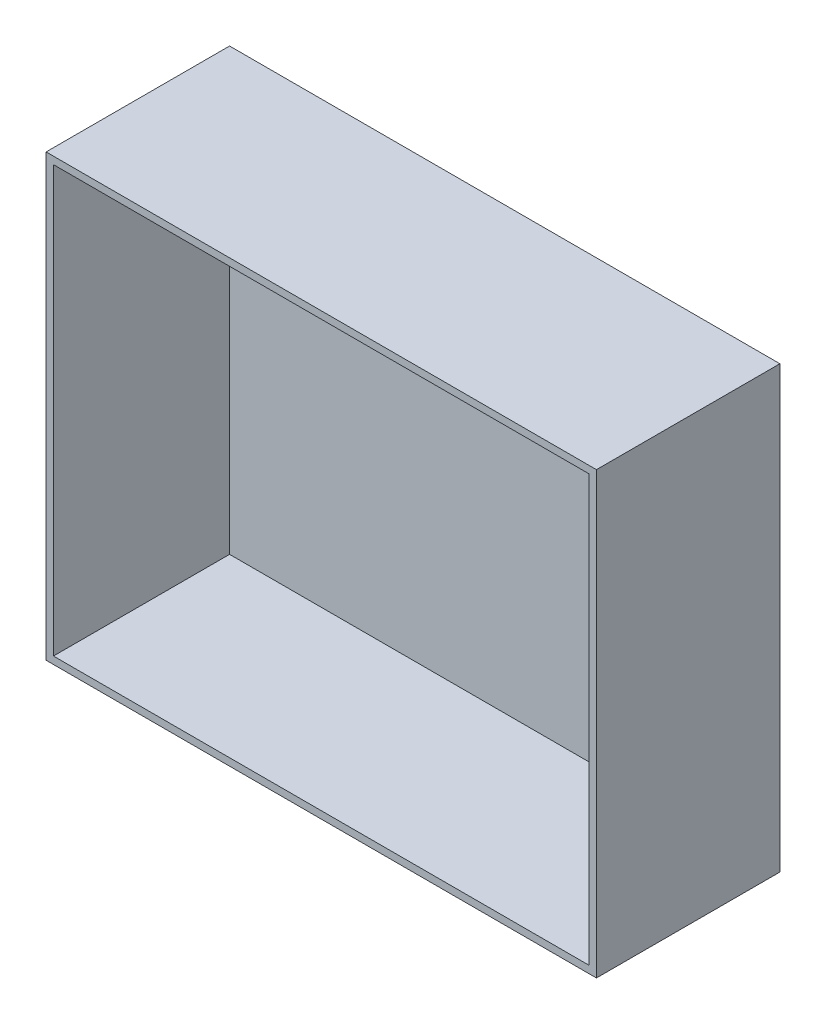
ISO-10303-21;
HEADER;
FILE_DESCRIPTION(('STEP AP214'),'2;1');
FILE_NAME('part.step','',(''),(''),'','','');
FILE_SCHEMA(('AUTOMOTIVE_DESIGN { 1 0 10303 214 1 1 1 1 }'));
ENDSEC;
DATA;
#1=APPLICATION_CONTEXT('core data for automotive mechanical design processes');
#2=APPLICATION_PROTOCOL_DEFINITION('international standard','automotive_design',2000,#1);
#3=PRODUCT_CONTEXT('',#1,'mechanical');
#4=PRODUCT('Part','Part','',(#3));
#5=PRODUCT_RELATED_PRODUCT_CATEGORY('part','',(#4));
#6=PRODUCT_DEFINITION_FORMATION('','',#4);
#7=PRODUCT_DEFINITION_CONTEXT('part definition',#1,'design');
#8=PRODUCT_DEFINITION('design','',#6,#7);
#9=PRODUCT_DEFINITION_SHAPE('','',#8);
#10=(LENGTH_UNIT() NAMED_UNIT(*) SI_UNIT(.MILLI.,.METRE.));
#11=(NAMED_UNIT(*) PLANE_ANGLE_UNIT() SI_UNIT($,.RADIAN.));
#12=(NAMED_UNIT(*) SI_UNIT($,.STERADIAN.) SOLID_ANGLE_UNIT());
#13=UNCERTAINTY_MEASURE_WITH_UNIT(LENGTH_MEASURE(1.E-05),#10,'distance_accuracy_value','');
#14=(GEOMETRIC_REPRESENTATION_CONTEXT(3) GLOBAL_UNCERTAINTY_ASSIGNED_CONTEXT((#13)) GLOBAL_UNIT_ASSIGNED_CONTEXT((#10,
#11,#12)) REPRESENTATION_CONTEXT('',''));
#15=CARTESIAN_POINT('',(0.,0.,0.));
#16=DIRECTION('',(0.,0.,1.));
#17=DIRECTION('',(1.,0.,0.));
#18=AXIS2_PLACEMENT_3D('',#15,#16,#17);
#19=CARTESIAN_POINT('',(75.,60.,25.));
#20=DIRECTION('',(-1.,0.,0.));
#21=DIRECTION('',(0.,-1.,0.));
#22=AXIS2_PLACEMENT_3D('',#19,#20,#21);
#23=PLANE('',#22);
#24=DIRECTION('',(0.,1.,0.));
#25=VECTOR('',#24,1.);
#26=CARTESIAN_POINT('',(75.,60.,-25.));
#27=LINE('',#26,#25);
#28=CARTESIAN_POINT('',(75.,-60.,-25.));
#29=VERTEX_POINT('',#28);
#30=CARTESIAN_POINT('',(75.,60.,-25.));
#31=VERTEX_POINT('',#30);
#32=EDGE_CURVE('E147',#29,#31,#27,.T.);
#33=ORIENTED_EDGE('',*,*,#32,.T.);
#34=DIRECTION('',(0.,0.,-1.));
#35=VECTOR('',#34,1.);
#36=CARTESIAN_POINT('',(75.,60.,25.));
#37=LINE('',#36,#35);
#38=CARTESIAN_POINT('',(75.,60.,25.));
#39=VERTEX_POINT('',#38);
#40=EDGE_CURVE('E11',#39,#31,#37,.T.);
#41=ORIENTED_EDGE('',*,*,#40,.F.);
#42=DIRECTION('',(0.,1.,0.));
#43=VECTOR('',#42,1.);
#44=CARTESIAN_POINT('',(75.,60.,25.));
#45=LINE('',#44,#43);
#46=CARTESIAN_POINT('',(75.,-60.,25.));
#47=VERTEX_POINT('',#46);
#48=EDGE_CURVE('E140',#47,#39,#45,.T.);
#49=ORIENTED_EDGE('',*,*,#48,.F.);
#50=DIRECTION('',(0.,0.,-1.));
#51=VECTOR('',#50,1.);
#52=CARTESIAN_POINT('',(75.,-60.,25.));
#53=LINE('',#52,#51);
#54=EDGE_CURVE('E146',#47,#29,#53,.T.);
#55=ORIENTED_EDGE('',*,*,#54,.T.);
#56=EDGE_LOOP('',(#33,#41,#49,#55));
#57=FACE_BOUND('',#56,.T.);
#58=ADVANCED_FACE('F33',(#57),#23,.F.);
#59=CARTESIAN_POINT('',(-75.,60.,25.));
#60=DIRECTION('',(0.,-1.,0.));
#61=DIRECTION('',(0.,0.,-1.));
#62=AXIS2_PLACEMENT_3D('',#59,#60,#61);
#63=PLANE('',#62);
#64=DIRECTION('',(-1.,0.,0.));
#65=VECTOR('',#64,1.);
#66=CARTESIAN_POINT('',(-75.,60.,-25.));
#67=LINE('',#66,#65);
#68=CARTESIAN_POINT('',(-75.,60.,-25.));
#69=VERTEX_POINT('',#68);
#70=EDGE_CURVE('E150',#31,#69,#67,.T.);
#71=ORIENTED_EDGE('',*,*,#70,.T.);
#72=DIRECTION('',(0.,0.,-1.));
#73=VECTOR('',#72,1.);
#74=CARTESIAN_POINT('',(-75.,60.,25.));
#75=LINE('',#74,#73);
#76=CARTESIAN_POINT('',(-75.,60.,25.));
#77=VERTEX_POINT('',#76);
#78=EDGE_CURVE('E40',#77,#69,#75,.T.);
#79=ORIENTED_EDGE('',*,*,#78,.F.);
#80=DIRECTION('',(-1.,0.,0.));
#81=VECTOR('',#80,1.);
#82=CARTESIAN_POINT('',(-75.,60.,25.));
#83=LINE('',#82,#81);
#84=EDGE_CURVE('E84',#39,#77,#83,.T.);
#85=ORIENTED_EDGE('',*,*,#84,.F.);
#86=ORIENTED_EDGE('',*,*,#40,.T.);
#87=EDGE_LOOP('',(#71,#79,#85,#86));
#88=FACE_BOUND('',#87,.T.);
#89=ADVANCED_FACE('F179',(#88),#63,.F.);
#90=CARTESIAN_POINT('',(-75.,60.,25.));
#91=DIRECTION('',(1.,0.,0.));
#92=DIRECTION('',(0.,1.,0.));
#93=AXIS2_PLACEMENT_3D('',#90,#91,#92);
#94=PLANE('',#93);
#95=DIRECTION('',(0.,-1.,0.));
#96=VECTOR('',#95,1.);
#97=CARTESIAN_POINT('',(-75.,60.,-25.));
#98=LINE('',#97,#96);
#99=CARTESIAN_POINT('',(-75.,-60.,-25.));
#100=VERTEX_POINT('',#99);
#101=EDGE_CURVE('E152',#69,#100,#98,.T.);
#102=ORIENTED_EDGE('',*,*,#101,.T.);
#103=DIRECTION('',(0.,0.,-1.));
#104=VECTOR('',#103,1.);
#105=CARTESIAN_POINT('',(-75.,-60.,25.));
#106=LINE('',#105,#104);
#107=CARTESIAN_POINT('',(-75.,-60.,25.));
#108=VERTEX_POINT('',#107);
#109=EDGE_CURVE('E156',#108,#100,#106,.T.);
#110=ORIENTED_EDGE('',*,*,#109,.F.);
#111=DIRECTION('',(0.,-1.,0.));
#112=VECTOR('',#111,1.);
#113=CARTESIAN_POINT('',(-75.,60.,25.));
#114=LINE('',#113,#112);
#115=EDGE_CURVE('E143',#77,#108,#114,.T.);
#116=ORIENTED_EDGE('',*,*,#115,.F.);
#117=ORIENTED_EDGE('',*,*,#78,.T.);
#118=EDGE_LOOP('',(#102,#110,#116,#117));
#119=FACE_BOUND('',#118,.T.);
#120=ADVANCED_FACE('F161',(#119),#94,.F.);
#121=CARTESIAN_POINT('',(-75.,-60.,25.));
#122=DIRECTION('',(0.,1.,0.));
#123=DIRECTION('',(0.,0.,1.));
#124=AXIS2_PLACEMENT_3D('',#121,#122,#123);
#125=PLANE('',#124);
#126=DIRECTION('',(1.,0.,0.));
#127=VECTOR('',#126,1.);
#128=CARTESIAN_POINT('',(-75.,-60.,-25.));
#129=LINE('',#128,#127);
#130=EDGE_CURVE('E77',#100,#29,#129,.T.);
#131=ORIENTED_EDGE('',*,*,#130,.T.);
#132=ORIENTED_EDGE('',*,*,#54,.F.);
#133=DIRECTION('',(1.,0.,0.));
#134=VECTOR('',#133,1.);
#135=CARTESIAN_POINT('',(-75.,-60.,25.));
#136=LINE('',#135,#134);
#137=EDGE_CURVE('E56',#108,#47,#136,.T.);
#138=ORIENTED_EDGE('',*,*,#137,.F.);
#139=ORIENTED_EDGE('',*,*,#109,.T.);
#140=EDGE_LOOP('',(#131,#132,#138,#139));
#141=FACE_BOUND('',#140,.T.);
#142=ADVANCED_FACE('F169',(#141),#125,.F.);
#143=CARTESIAN_POINT('',(0.,0.,25.));
#144=DIRECTION('',(0.,0.,1.));
#145=DIRECTION('',(1.,0.,0.));
#146=AXIS2_PLACEMENT_3D('',#143,#144,#145);
#147=PLANE('',#146);
#148=DIRECTION('',(0.,1.,0.));
#149=VECTOR('',#148,1.);
#150=CARTESIAN_POINT('',(73.,60.,25.));
#151=LINE('',#150,#149);
#152=CARTESIAN_POINT('',(73.,-58.,25.));
#153=VERTEX_POINT('',#152);
#154=CARTESIAN_POINT('',(73.,58.,25.));
#155=VERTEX_POINT('',#154);
#156=EDGE_CURVE('E129',#153,#155,#151,.T.);
#157=ORIENTED_EDGE('',*,*,#156,.F.);
#158=DIRECTION('',(1.,0.,0.));
#159=VECTOR('',#158,1.);
#160=CARTESIAN_POINT('',(-75.,-58.,25.));
#161=LINE('',#160,#159);
#162=CARTESIAN_POINT('',(-73.,-58.,25.));
#163=VERTEX_POINT('',#162);
#164=EDGE_CURVE('E138',#163,#153,#161,.T.);
#165=ORIENTED_EDGE('',*,*,#164,.F.);
#166=DIRECTION('',(0.,-1.,0.));
#167=VECTOR('',#166,1.);
#168=CARTESIAN_POINT('',(-73.,60.,25.));
#169=LINE('',#168,#167);
#170=CARTESIAN_POINT('',(-73.,58.,25.));
#171=VERTEX_POINT('',#170);
#172=EDGE_CURVE('E136',#171,#163,#169,.T.);
#173=ORIENTED_EDGE('',*,*,#172,.F.);
#174=DIRECTION('',(-1.,0.,0.));
#175=VECTOR('',#174,1.);
#176=CARTESIAN_POINT('',(-75.,58.,25.));
#177=LINE('',#176,#175);
#178=EDGE_CURVE('E121',#155,#171,#177,.T.);
#179=ORIENTED_EDGE('',*,*,#178,.F.);
#180=EDGE_LOOP('',(#157,#165,#173,#179));
#181=FACE_BOUND('',#180,.T.);
#182=ORIENTED_EDGE('',*,*,#48,.T.);
#183=ORIENTED_EDGE('',*,*,#84,.T.);
#184=ORIENTED_EDGE('',*,*,#115,.T.);
#185=ORIENTED_EDGE('',*,*,#137,.T.);
#186=EDGE_LOOP('',(#182,#183,#184,#185));
#187=FACE_BOUND('',#186,.T.);
#188=ADVANCED_FACE('F171',(#181,#187),#147,.T.);
#189=CARTESIAN_POINT('',(0.,0.,-25.));
#190=DIRECTION('',(0.,0.,1.));
#191=DIRECTION('',(1.,0.,0.));
#192=AXIS2_PLACEMENT_3D('',#189,#190,#191);
#193=PLANE('',#192);
#194=ORIENTED_EDGE('',*,*,#32,.F.);
#195=ORIENTED_EDGE('',*,*,#130,.F.);
#196=ORIENTED_EDGE('',*,*,#101,.F.);
#197=ORIENTED_EDGE('',*,*,#70,.F.);
#198=EDGE_LOOP('',(#194,#195,#196,#197));
#199=FACE_BOUND('',#198,.T.);
#200=ADVANCED_FACE('F165',(#199),#193,.F.);
#201=CARTESIAN_POINT('',(73.,60.,25.));
#202=DIRECTION('',(-1.,0.,0.));
#203=DIRECTION('',(0.,-1.,0.));
#204=AXIS2_PLACEMENT_3D('',#201,#202,#203);
#205=PLANE('',#204);
#206=DIRECTION('',(0.,1.,0.));
#207=VECTOR('',#206,1.);
#208=CARTESIAN_POINT('',(73.,60.,-23.));
#209=LINE('',#208,#207);
#210=CARTESIAN_POINT('',(73.,-58.,-23.));
#211=VERTEX_POINT('',#210);
#212=CARTESIAN_POINT('',(73.,58.,-23.));
#213=VERTEX_POINT('',#212);
#214=EDGE_CURVE('E112',#211,#213,#209,.T.);
#215=ORIENTED_EDGE('',*,*,#214,.F.);
#216=DIRECTION('',(0.,0.,-1.));
#217=VECTOR('',#216,1.);
#218=CARTESIAN_POINT('',(73.,-58.,25.));
#219=LINE('',#218,#217);
#220=EDGE_CURVE('E132',#153,#211,#219,.T.);
#221=ORIENTED_EDGE('',*,*,#220,.F.);
#222=ORIENTED_EDGE('',*,*,#156,.T.);
#223=DIRECTION('',(0.,0.,-1.));
#224=VECTOR('',#223,1.);
#225=CARTESIAN_POINT('',(73.,58.,25.));
#226=LINE('',#225,#224);
#227=EDGE_CURVE('E124',#155,#213,#226,.T.);
#228=ORIENTED_EDGE('',*,*,#227,.T.);
#229=EDGE_LOOP('',(#215,#221,#222,#228));
#230=FACE_BOUND('',#229,.T.);
#231=ADVANCED_FACE('F206',(#230),#205,.T.);
#232=CARTESIAN_POINT('',(-75.,58.,25.));
#233=DIRECTION('',(0.,-1.,0.));
#234=DIRECTION('',(0.,0.,-1.));
#235=AXIS2_PLACEMENT_3D('',#232,#233,#234);
#236=PLANE('',#235);
#237=DIRECTION('',(-1.,0.,0.));
#238=VECTOR('',#237,1.);
#239=CARTESIAN_POINT('',(-75.,58.,-23.));
#240=LINE('',#239,#238);
#241=CARTESIAN_POINT('',(-73.,58.,-23.));
#242=VERTEX_POINT('',#241);
#243=EDGE_CURVE('E106',#213,#242,#240,.T.);
#244=ORIENTED_EDGE('',*,*,#243,.F.);
#245=ORIENTED_EDGE('',*,*,#227,.F.);
#246=ORIENTED_EDGE('',*,*,#178,.T.);
#247=DIRECTION('',(0.,0.,-1.));
#248=VECTOR('',#247,1.);
#249=CARTESIAN_POINT('',(-73.,58.,25.));
#250=LINE('',#249,#248);
#251=EDGE_CURVE('E118',#171,#242,#250,.T.);
#252=ORIENTED_EDGE('',*,*,#251,.T.);
#253=EDGE_LOOP('',(#244,#245,#246,#252));
#254=FACE_BOUND('',#253,.T.);
#255=ADVANCED_FACE('F119',(#254),#236,.T.);
#256=CARTESIAN_POINT('',(-73.,60.,25.));
#257=DIRECTION('',(1.,0.,0.));
#258=DIRECTION('',(0.,1.,0.));
#259=AXIS2_PLACEMENT_3D('',#256,#257,#258);
#260=PLANE('',#259);
#261=DIRECTION('',(0.,-1.,0.));
#262=VECTOR('',#261,1.);
#263=CARTESIAN_POINT('',(-73.,60.,-23.));
#264=LINE('',#263,#262);
#265=CARTESIAN_POINT('',(-73.,-58.,-23.));
#266=VERTEX_POINT('',#265);
#267=EDGE_CURVE('E110',#242,#266,#264,.T.);
#268=ORIENTED_EDGE('',*,*,#267,.F.);
#269=ORIENTED_EDGE('',*,*,#251,.F.);
#270=ORIENTED_EDGE('',*,*,#172,.T.);
#271=DIRECTION('',(0.,0.,-1.));
#272=VECTOR('',#271,1.);
#273=CARTESIAN_POINT('',(-73.,-58.,25.));
#274=LINE('',#273,#272);
#275=EDGE_CURVE('E47',#163,#266,#274,.T.);
#276=ORIENTED_EDGE('',*,*,#275,.T.);
#277=EDGE_LOOP('',(#268,#269,#270,#276));
#278=FACE_BOUND('',#277,.T.);
#279=ADVANCED_FACE('F126',(#278),#260,.T.);
#280=CARTESIAN_POINT('',(-75.,-58.,25.));
#281=DIRECTION('',(0.,1.,0.));
#282=DIRECTION('',(0.,0.,1.));
#283=AXIS2_PLACEMENT_3D('',#280,#281,#282);
#284=PLANE('',#283);
#285=DIRECTION('',(1.,0.,0.));
#286=VECTOR('',#285,1.);
#287=CARTESIAN_POINT('',(-75.,-58.,-23.));
#288=LINE('',#287,#286);
#289=EDGE_CURVE('E127',#266,#211,#288,.T.);
#290=ORIENTED_EDGE('',*,*,#289,.F.);
#291=ORIENTED_EDGE('',*,*,#275,.F.);
#292=ORIENTED_EDGE('',*,*,#164,.T.);
#293=ORIENTED_EDGE('',*,*,#220,.T.);
#294=EDGE_LOOP('',(#290,#291,#292,#293));
#295=FACE_BOUND('',#294,.T.);
#296=ADVANCED_FACE('F236',(#295),#284,.T.);
#297=CARTESIAN_POINT('',(0.,0.,-23.));
#298=DIRECTION('',(0.,0.,1.));
#299=DIRECTION('',(1.,0.,0.));
#300=AXIS2_PLACEMENT_3D('',#297,#298,#299);
#301=PLANE('',#300);
#302=ORIENTED_EDGE('',*,*,#214,.T.);
#303=ORIENTED_EDGE('',*,*,#243,.T.);
#304=ORIENTED_EDGE('',*,*,#267,.T.);
#305=ORIENTED_EDGE('',*,*,#289,.T.);
#306=EDGE_LOOP('',(#302,#303,#304,#305));
#307=FACE_BOUND('',#306,.T.);
#308=ADVANCED_FACE('F108',(#307),#301,.T.);
#309=CLOSED_SHELL('',(#58,#89,#120,#142,#188,#200,#231,#255,#279,#296,#308));
#310=MANIFOLD_SOLID_BREP('B2',#309);
#311=ADVANCED_BREP_SHAPE_REPRESENTATION('',(#18,#310),#14);
#312=SHAPE_DEFINITION_REPRESENTATION(#9,#311);
ENDSEC;
END-ISO-10303-21;
